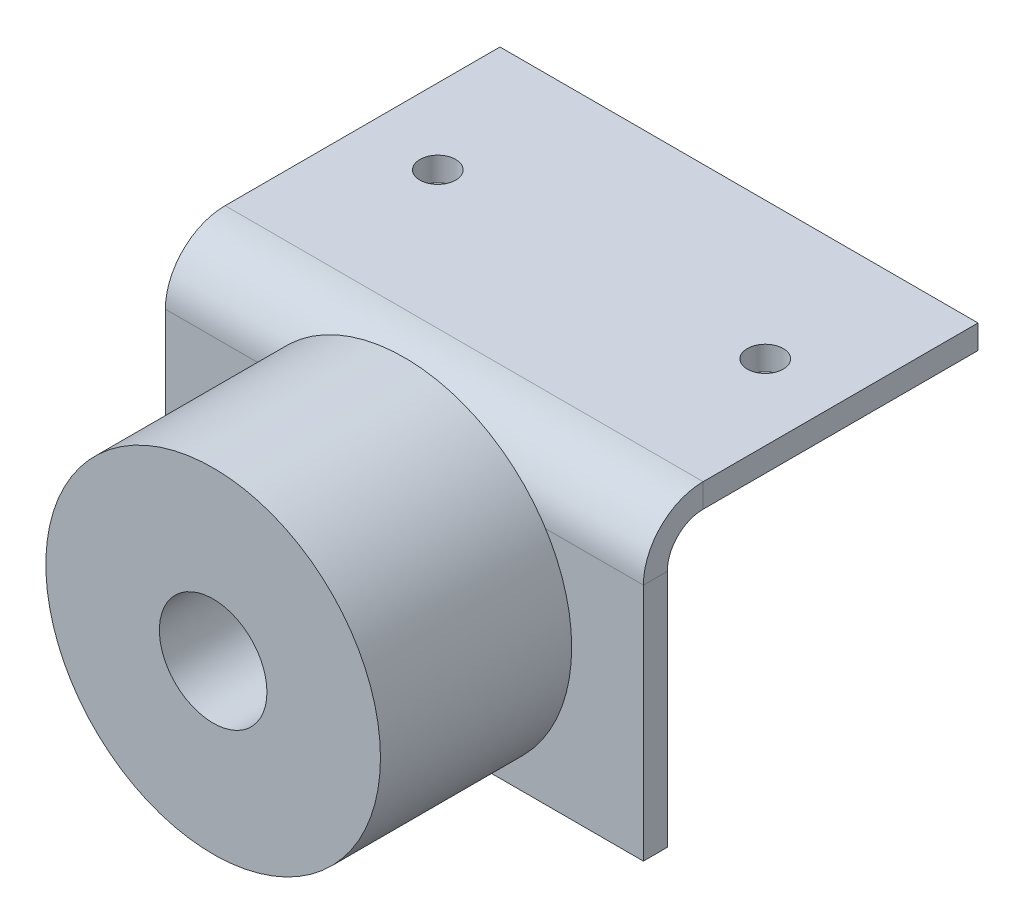
ISO-10303-21;
HEADER;
FILE_DESCRIPTION(('STEP AP214'),'2;1');
FILE_NAME('part.step','',(''),(''),'','','');
FILE_SCHEMA(('AUTOMOTIVE_DESIGN { 1 0 10303 214 1 1 1 1 }'));
ENDSEC;
DATA;
#1=APPLICATION_CONTEXT('core data for automotive mechanical design processes');
#2=APPLICATION_PROTOCOL_DEFINITION('international standard','automotive_design',2000,#1);
#3=PRODUCT_CONTEXT('',#1,'mechanical');
#4=PRODUCT('Part','Part','',(#3));
#5=PRODUCT_RELATED_PRODUCT_CATEGORY('part','',(#4));
#6=PRODUCT_DEFINITION_FORMATION('','',#4);
#7=PRODUCT_DEFINITION_CONTEXT('part definition',#1,'design');
#8=PRODUCT_DEFINITION('design','',#6,#7);
#9=PRODUCT_DEFINITION_SHAPE('','',#8);
#10=(LENGTH_UNIT() NAMED_UNIT(*) SI_UNIT(.MILLI.,.METRE.));
#11=(NAMED_UNIT(*) PLANE_ANGLE_UNIT() SI_UNIT($,.RADIAN.));
#12=(NAMED_UNIT(*) SI_UNIT($,.STERADIAN.) SOLID_ANGLE_UNIT());
#13=UNCERTAINTY_MEASURE_WITH_UNIT(LENGTH_MEASURE(1.E-05),#10,'distance_accuracy_value','');
#14=(GEOMETRIC_REPRESENTATION_CONTEXT(3) GLOBAL_UNCERTAINTY_ASSIGNED_CONTEXT((#13)) GLOBAL_UNIT_ASSIGNED_CONTEXT((#10,
#11,#12)) REPRESENTATION_CONTEXT('',''));
#15=CARTESIAN_POINT('',(0.,0.,0.));
#16=DIRECTION('',(0.,0.,1.));
#17=DIRECTION('',(1.,0.,0.));
#18=AXIS2_PLACEMENT_3D('',#15,#16,#17);
#19=CARTESIAN_POINT('',(20.,12.5,-5.));
#20=DIRECTION('',(1.,0.,0.));
#21=DIRECTION('',(0.,0.,-1.));
#22=AXIS2_PLACEMENT_3D('',#19,#20,#21);
#23=PLANE('',#22);
#24=DIRECTION('',(0.,-1.,0.));
#25=VECTOR('',#24,1.);
#26=CARTESIAN_POINT('',(20.,12.5,-5.));
#27=LINE('',#26,#25);
#28=CARTESIAN_POINT('',(20.,12.5,-5.));
#29=VERTEX_POINT('',#28);
#30=CARTESIAN_POINT('',(20.,10.5,-5.));
#31=VERTEX_POINT('',#30);
#32=EDGE_CURVE('E12',#29,#31,#27,.T.);
#33=ORIENTED_EDGE('',*,*,#32,.F.);
#34=CARTESIAN_POINT('',(20.,7.5,-5.));
#35=DIRECTION('',(1.,0.,0.));
#36=DIRECTION('',(0.,0.,-1.));
#37=AXIS2_PLACEMENT_3D('',#34,#35,#36);
#38=CIRCLE('',#37,5.);
#39=CARTESIAN_POINT('',(20.,7.5,0.));
#40=VERTEX_POINT('',#39);
#41=EDGE_CURVE('E147',#40,#29,#38,.F.);
#42=ORIENTED_EDGE('',*,*,#41,.F.);
#43=DIRECTION('',(0.,0.,1.));
#44=VECTOR('',#43,1.);
#45=CARTESIAN_POINT('',(20.,7.5,-2.));
#46=LINE('',#45,#44);
#47=CARTESIAN_POINT('',(20.,7.5,-2.));
#48=VERTEX_POINT('',#47);
#49=EDGE_CURVE('E58',#48,#40,#46,.T.);
#50=ORIENTED_EDGE('',*,*,#49,.F.);
#51=CARTESIAN_POINT('',(20.,7.5,-5.));
#52=DIRECTION('',(1.,0.,0.));
#53=DIRECTION('',(0.,0.,-1.));
#54=AXIS2_PLACEMENT_3D('',#51,#52,#53);
#55=CIRCLE('',#54,3.);
#56=EDGE_CURVE('E140',#48,#31,#55,.F.);
#57=ORIENTED_EDGE('',*,*,#56,.T.);
#58=EDGE_LOOP('',(#33,#42,#50,#57));
#59=FACE_BOUND('',#58,.T.);
#60=ADVANCED_FACE('F49',(#59),#23,.T.);
#61=CARTESIAN_POINT('',(20.,7.5,-2.));
#62=DIRECTION('',(1.,0.,0.));
#63=DIRECTION('',(0.,0.,-1.));
#64=AXIS2_PLACEMENT_3D('',#61,#62,#63);
#65=PLANE('',#64);
#66=DIRECTION('',(0.,0.,-1.));
#67=VECTOR('',#66,1.);
#68=CARTESIAN_POINT('',(20.,12.5,0.));
#69=LINE('',#68,#67);
#70=CARTESIAN_POINT('',(20.,12.5,-28.));
#71=VERTEX_POINT('',#70);
#72=EDGE_CURVE('E198',#29,#71,#69,.T.);
#73=ORIENTED_EDGE('',*,*,#72,.F.);
#74=ORIENTED_EDGE('',*,*,#32,.T.);
#75=DIRECTION('',(0.,0.,-1.));
#76=VECTOR('',#75,1.);
#77=CARTESIAN_POINT('',(20.,10.5,0.));
#78=LINE('',#77,#76);
#79=CARTESIAN_POINT('',(20.,10.5,-28.));
#80=VERTEX_POINT('',#79);
#81=EDGE_CURVE('E106',#31,#80,#78,.T.);
#82=ORIENTED_EDGE('',*,*,#81,.T.);
#83=DIRECTION('',(0.,-1.,0.));
#84=VECTOR('',#83,1.);
#85=CARTESIAN_POINT('',(20.,12.5,-28.));
#86=LINE('',#85,#84);
#87=EDGE_CURVE('E387',#71,#80,#86,.T.);
#88=ORIENTED_EDGE('',*,*,#87,.F.);
#89=EDGE_LOOP('',(#73,#74,#82,#88));
#90=FACE_BOUND('',#89,.T.);
#91=ADVANCED_FACE('F206',(#90),#65,.T.);
#92=CARTESIAN_POINT('',(-20.,7.5,0.));
#93=DIRECTION('',(-1.,0.,0.));
#94=DIRECTION('',(0.,0.,1.));
#95=AXIS2_PLACEMENT_3D('',#92,#93,#94);
#96=PLANE('',#95);
#97=DIRECTION('',(0.,0.,-1.));
#98=VECTOR('',#97,1.);
#99=CARTESIAN_POINT('',(-20.,7.5,0.));
#100=LINE('',#99,#98);
#101=CARTESIAN_POINT('',(-20.,7.5,0.));
#102=VERTEX_POINT('',#101);
#103=CARTESIAN_POINT('',(-20.,7.5,-2.));
#104=VERTEX_POINT('',#103);
#105=EDGE_CURVE('E93',#102,#104,#100,.T.);
#106=ORIENTED_EDGE('',*,*,#105,.F.);
#107=CARTESIAN_POINT('',(-20.,7.5,-5.));
#108=DIRECTION('',(1.,0.,0.));
#109=DIRECTION('',(0.,0.,-1.));
#110=AXIS2_PLACEMENT_3D('',#107,#108,#109);
#111=CIRCLE('',#110,5.);
#112=CARTESIAN_POINT('',(-20.,12.5,-5.));
#113=VERTEX_POINT('',#112);
#114=EDGE_CURVE('E163',#102,#113,#111,.F.);
#115=ORIENTED_EDGE('',*,*,#114,.T.);
#116=DIRECTION('',(0.,1.,0.));
#117=VECTOR('',#116,1.);
#118=CARTESIAN_POINT('',(-20.,10.5,-5.));
#119=LINE('',#118,#117);
#120=CARTESIAN_POINT('',(-20.,10.5,-5.));
#121=VERTEX_POINT('',#120);
#122=EDGE_CURVE('E100',#121,#113,#119,.T.);
#123=ORIENTED_EDGE('',*,*,#122,.F.);
#124=CARTESIAN_POINT('',(-20.,7.5,-5.));
#125=DIRECTION('',(1.,0.,0.));
#126=DIRECTION('',(0.,0.,-1.));
#127=AXIS2_PLACEMENT_3D('',#124,#125,#126);
#128=CIRCLE('',#127,3.);
#129=EDGE_CURVE('E170',#104,#121,#128,.F.);
#130=ORIENTED_EDGE('',*,*,#129,.F.);
#131=EDGE_LOOP('',(#106,#115,#123,#130));
#132=FACE_BOUND('',#131,.T.);
#133=ADVANCED_FACE('F204',(#132),#96,.T.);
#134=CARTESIAN_POINT('',(-20.,10.5,-5.));
#135=DIRECTION('',(-1.,0.,0.));
#136=DIRECTION('',(0.,0.,1.));
#137=AXIS2_PLACEMENT_3D('',#134,#135,#136);
#138=PLANE('',#137);
#139=DIRECTION('',(0.,1.,0.));
#140=VECTOR('',#139,1.);
#141=CARTESIAN_POINT('',(-20.,12.5,0.));
#142=LINE('',#141,#140);
#143=CARTESIAN_POINT('',(-20.,-12.5,0.));
#144=VERTEX_POINT('',#143);
#145=EDGE_CURVE('E165',#144,#102,#142,.T.);
#146=ORIENTED_EDGE('',*,*,#145,.T.);
#147=ORIENTED_EDGE('',*,*,#105,.T.);
#148=DIRECTION('',(0.,1.,0.));
#149=VECTOR('',#148,1.);
#150=CARTESIAN_POINT('',(-20.,12.5,-2.));
#151=LINE('',#150,#149);
#152=CARTESIAN_POINT('',(-20.,-12.5,-2.));
#153=VERTEX_POINT('',#152);
#154=EDGE_CURVE('E168',#153,#104,#151,.T.);
#155=ORIENTED_EDGE('',*,*,#154,.F.);
#156=DIRECTION('',(0.,0.,1.));
#157=VECTOR('',#156,1.);
#158=CARTESIAN_POINT('',(-20.,-12.5,-2.));
#159=LINE('',#158,#157);
#160=EDGE_CURVE('E128',#153,#144,#159,.T.);
#161=ORIENTED_EDGE('',*,*,#160,.T.);
#162=EDGE_LOOP('',(#146,#147,#155,#161));
#163=FACE_BOUND('',#162,.T.);
#164=ADVANCED_FACE('F200',(#163),#138,.T.);
#165=CARTESIAN_POINT('',(20.,10.5,0.));
#166=DIRECTION('',(0.,1.,0.));
#167=DIRECTION('',(0.,0.,1.));
#168=AXIS2_PLACEMENT_3D('',#165,#166,#167);
#169=PLANE('',#168);
#170=CARTESIAN_POINT('',(-13.7,10.5,-16.5));
#171=DIRECTION('',(0.,1.,0.));
#172=DIRECTION('',(0.,0.,1.));
#173=AXIS2_PLACEMENT_3D('',#170,#171,#172);
#174=CIRCLE('',#173,1.5);
#175=CARTESIAN_POINT('',(-13.7,10.5,-15.));
#176=VERTEX_POINT('',#175);
#177=EDGE_CURVE('E157',#176,#176,#174,.F.);
#178=ORIENTED_EDGE('',*,*,#177,.F.);
#179=EDGE_LOOP('',(#178));
#180=FACE_BOUND('',#179,.T.);
#181=CARTESIAN_POINT('',(13.7,10.5,-16.5));
#182=DIRECTION('',(0.,1.,0.));
#183=DIRECTION('',(0.,0.,1.));
#184=AXIS2_PLACEMENT_3D('',#181,#182,#183);
#185=CIRCLE('',#184,1.5);
#186=CARTESIAN_POINT('',(13.7,10.5,-15.));
#187=VERTEX_POINT('',#186);
#188=EDGE_CURVE('E376',#187,#187,#185,.F.);
#189=ORIENTED_EDGE('',*,*,#188,.F.);
#190=EDGE_LOOP('',(#189));
#191=FACE_BOUND('',#190,.T.);
#192=DIRECTION('',(0.,0.,-1.));
#193=VECTOR('',#192,1.);
#194=CARTESIAN_POINT('',(-20.,10.5,0.));
#195=LINE('',#194,#193);
#196=CARTESIAN_POINT('',(-20.,10.5,-28.));
#197=VERTEX_POINT('',#196);
#198=EDGE_CURVE('E153',#121,#197,#195,.T.);
#199=ORIENTED_EDGE('',*,*,#198,.T.);
#200=DIRECTION('',(-1.,0.,0.));
#201=VECTOR('',#200,1.);
#202=CARTESIAN_POINT('',(20.,10.5,-28.));
#203=LINE('',#202,#201);
#204=EDGE_CURVE('E184',#80,#197,#203,.T.);
#205=ORIENTED_EDGE('',*,*,#204,.F.);
#206=ORIENTED_EDGE('',*,*,#81,.F.);
#207=DIRECTION('',(-1.,0.,0.));
#208=VECTOR('',#207,1.);
#209=CARTESIAN_POINT('',(20.,10.5,-5.));
#210=LINE('',#209,#208);
#211=EDGE_CURVE('E152',#31,#121,#210,.T.);
#212=ORIENTED_EDGE('',*,*,#211,.T.);
#213=EDGE_LOOP('',(#199,#205,#206,#212));
#214=FACE_BOUND('',#213,.T.);
#215=ADVANCED_FACE('F212',(#180,#191,#214),#169,.F.);
#216=CARTESIAN_POINT('',(20.,12.5,-28.));
#217=DIRECTION('',(0.,0.,-1.));
#218=DIRECTION('',(-1.,0.,0.));
#219=AXIS2_PLACEMENT_3D('',#216,#217,#218);
#220=PLANE('',#219);
#221=DIRECTION('',(0.,-1.,0.));
#222=VECTOR('',#221,1.);
#223=CARTESIAN_POINT('',(-20.,12.5,-28.));
#224=LINE('',#223,#222);
#225=CARTESIAN_POINT('',(-20.,12.5,-28.));
#226=VERTEX_POINT('',#225);
#227=EDGE_CURVE('E156',#226,#197,#224,.T.);
#228=ORIENTED_EDGE('',*,*,#227,.F.);
#229=DIRECTION('',(-1.,0.,0.));
#230=VECTOR('',#229,1.);
#231=CARTESIAN_POINT('',(20.,12.5,-28.));
#232=LINE('',#231,#230);
#233=EDGE_CURVE('E182',#71,#226,#232,.T.);
#234=ORIENTED_EDGE('',*,*,#233,.F.);
#235=ORIENTED_EDGE('',*,*,#87,.T.);
#236=ORIENTED_EDGE('',*,*,#204,.T.);
#237=EDGE_LOOP('',(#228,#234,#235,#236));
#238=FACE_BOUND('',#237,.T.);
#239=ADVANCED_FACE('F241',(#238),#220,.T.);
#240=CARTESIAN_POINT('',(20.,12.5,0.));
#241=DIRECTION('',(0.,1.,0.));
#242=DIRECTION('',(0.,0.,1.));
#243=AXIS2_PLACEMENT_3D('',#240,#241,#242);
#244=PLANE('',#243);
#245=CARTESIAN_POINT('',(-13.7,12.5,-16.5));
#246=DIRECTION('',(0.,1.,0.));
#247=DIRECTION('',(0.,0.,1.));
#248=AXIS2_PLACEMENT_3D('',#245,#246,#247);
#249=CIRCLE('',#248,1.5);
#250=CARTESIAN_POINT('',(-13.7,12.5,-15.));
#251=VERTEX_POINT('',#250);
#252=EDGE_CURVE('E379',#251,#251,#249,.T.);
#253=ORIENTED_EDGE('',*,*,#252,.F.);
#254=EDGE_LOOP('',(#253));
#255=FACE_BOUND('',#254,.T.);
#256=CARTESIAN_POINT('',(13.7,12.5,-16.5));
#257=DIRECTION('',(0.,1.,0.));
#258=DIRECTION('',(0.,0.,1.));
#259=AXIS2_PLACEMENT_3D('',#256,#257,#258);
#260=CIRCLE('',#259,1.5);
#261=CARTESIAN_POINT('',(13.7,12.5,-15.));
#262=VERTEX_POINT('',#261);
#263=EDGE_CURVE('E373',#262,#262,#260,.T.);
#264=ORIENTED_EDGE('',*,*,#263,.F.);
#265=EDGE_LOOP('',(#264));
#266=FACE_BOUND('',#265,.T.);
#267=DIRECTION('',(0.,0.,-1.));
#268=VECTOR('',#267,1.);
#269=CARTESIAN_POINT('',(-20.,12.5,0.));
#270=LINE('',#269,#268);
#271=EDGE_CURVE('E160',#113,#226,#270,.T.);
#272=ORIENTED_EDGE('',*,*,#271,.F.);
#273=DIRECTION('',(-1.,0.,0.));
#274=VECTOR('',#273,1.);
#275=CARTESIAN_POINT('',(20.,12.5,-5.));
#276=LINE('',#275,#274);
#277=EDGE_CURVE('E179',#29,#113,#276,.T.);
#278=ORIENTED_EDGE('',*,*,#277,.F.);
#279=ORIENTED_EDGE('',*,*,#72,.T.);
#280=ORIENTED_EDGE('',*,*,#233,.T.);
#281=EDGE_LOOP('',(#272,#278,#279,#280));
#282=FACE_BOUND('',#281,.T.);
#283=ADVANCED_FACE('F246',(#255,#266,#282),#244,.T.);
#284=CARTESIAN_POINT('',(20.,7.5,-5.));
#285=DIRECTION('',(-1.,0.,0.));
#286=DIRECTION('',(0.,0.,1.));
#287=AXIS2_PLACEMENT_3D('',#284,#285,#286);
#288=CYLINDRICAL_SURFACE('',#287,5.);
#289=ORIENTED_EDGE('',*,*,#114,.F.);
#290=DIRECTION('',(-1.,0.,0.));
#291=VECTOR('',#290,1.);
#292=CARTESIAN_POINT('',(20.,7.5,0.));
#293=LINE('',#292,#291);
#294=EDGE_CURVE('E176',#40,#102,#293,.T.);
#295=ORIENTED_EDGE('',*,*,#294,.F.);
#296=ORIENTED_EDGE('',*,*,#41,.T.);
#297=ORIENTED_EDGE('',*,*,#277,.T.);
#298=EDGE_LOOP('',(#289,#295,#296,#297));
#299=FACE_BOUND('',#298,.T.);
#300=ADVANCED_FACE('F194',(#299),#288,.T.);
#301=CARTESIAN_POINT('',(20.,12.5,0.));
#302=DIRECTION('',(0.,0.,1.));
#303=DIRECTION('',(0.,-1.,0.));
#304=AXIS2_PLACEMENT_3D('',#301,#302,#303);
#305=PLANE('',#304);
#306=CARTESIAN_POINT('',(0.,0.,0.));
#307=DIRECTION('',(0.,0.,1.));
#308=DIRECTION('',(0.,-1.,0.));
#309=AXIS2_PLACEMENT_3D('',#306,#307,#308);
#310=CIRCLE('',#309,4.5);
#311=CARTESIAN_POINT('',(0.,-4.5,0.));
#312=VERTEX_POINT('',#311);
#313=EDGE_CURVE('E370',#312,#312,#310,.T.);
#314=ORIENTED_EDGE('',*,*,#313,.F.);
#315=EDGE_LOOP('',(#314));
#316=FACE_BOUND('',#315,.T.);
#317=ORIENTED_EDGE('',*,*,#145,.F.);
#318=DIRECTION('',(-1.,0.,0.));
#319=VECTOR('',#318,1.);
#320=CARTESIAN_POINT('',(20.,-12.5,0.));
#321=LINE('',#320,#319);
#322=CARTESIAN_POINT('',(20.,-12.5,0.));
#323=VERTEX_POINT('',#322);
#324=EDGE_CURVE('E130',#323,#144,#321,.T.);
#325=ORIENTED_EDGE('',*,*,#324,.F.);
#326=DIRECTION('',(0.,1.,0.));
#327=VECTOR('',#326,1.);
#328=CARTESIAN_POINT('',(20.,12.5,0.));
#329=LINE('',#328,#327);
#330=EDGE_CURVE('E145',#323,#40,#329,.T.);
#331=ORIENTED_EDGE('',*,*,#330,.T.);
#332=ORIENTED_EDGE('',*,*,#294,.T.);
#333=EDGE_LOOP('',(#317,#325,#331,#332));
#334=FACE_BOUND('',#333,.T.);
#335=ADVANCED_FACE('F199',(#316,#334),#305,.T.);
#336=CARTESIAN_POINT('',(20.,-12.5,-2.));
#337=DIRECTION('',(0.,-1.,0.));
#338=DIRECTION('',(0.,0.,-1.));
#339=AXIS2_PLACEMENT_3D('',#336,#337,#338);
#340=PLANE('',#339);
#341=ORIENTED_EDGE('',*,*,#160,.F.);
#342=DIRECTION('',(-1.,0.,0.));
#343=VECTOR('',#342,1.);
#344=CARTESIAN_POINT('',(20.,-12.5,-2.));
#345=LINE('',#344,#343);
#346=CARTESIAN_POINT('',(20.,-12.5,-2.));
#347=VERTEX_POINT('',#346);
#348=EDGE_CURVE('E122',#347,#153,#345,.T.);
#349=ORIENTED_EDGE('',*,*,#348,.F.);
#350=DIRECTION('',(0.,0.,1.));
#351=VECTOR('',#350,1.);
#352=CARTESIAN_POINT('',(20.,-12.5,-2.));
#353=LINE('',#352,#351);
#354=EDGE_CURVE('E126',#347,#323,#353,.T.);
#355=ORIENTED_EDGE('',*,*,#354,.T.);
#356=ORIENTED_EDGE('',*,*,#324,.T.);
#357=EDGE_LOOP('',(#341,#349,#355,#356));
#358=FACE_BOUND('',#357,.T.);
#359=ADVANCED_FACE('F124',(#358),#340,.T.);
#360=CARTESIAN_POINT('',(20.,12.5,-2.));
#361=DIRECTION('',(0.,0.,1.));
#362=DIRECTION('',(0.,-1.,0.));
#363=AXIS2_PLACEMENT_3D('',#360,#361,#362);
#364=PLANE('',#363);
#365=CARTESIAN_POINT('',(0.,0.,-2.));
#366=DIRECTION('',(0.,0.,1.));
#367=DIRECTION('',(0.,-1.,0.));
#368=AXIS2_PLACEMENT_3D('',#365,#366,#367);
#369=CIRCLE('',#368,4.5);
#370=CARTESIAN_POINT('',(0.,-4.5,-2.));
#371=VERTEX_POINT('',#370);
#372=EDGE_CURVE('E52',#371,#371,#369,.T.);
#373=ORIENTED_EDGE('',*,*,#372,.T.);
#374=EDGE_LOOP('',(#373));
#375=FACE_BOUND('',#374,.T.);
#376=ORIENTED_EDGE('',*,*,#154,.T.);
#377=DIRECTION('',(-1.,0.,0.));
#378=VECTOR('',#377,1.);
#379=CARTESIAN_POINT('',(20.,7.5,-2.));
#380=LINE('',#379,#378);
#381=EDGE_CURVE('E131',#48,#104,#380,.T.);
#382=ORIENTED_EDGE('',*,*,#381,.F.);
#383=DIRECTION('',(0.,1.,0.));
#384=VECTOR('',#383,1.);
#385=CARTESIAN_POINT('',(20.,12.5,-2.));
#386=LINE('',#385,#384);
#387=EDGE_CURVE('E135',#347,#48,#386,.T.);
#388=ORIENTED_EDGE('',*,*,#387,.F.);
#389=ORIENTED_EDGE('',*,*,#348,.T.);
#390=EDGE_LOOP('',(#376,#382,#388,#389));
#391=FACE_BOUND('',#390,.T.);
#392=ADVANCED_FACE('F136',(#375,#391),#364,.F.);
#393=CARTESIAN_POINT('',(20.,7.5,-5.));
#394=DIRECTION('',(-1.,0.,0.));
#395=DIRECTION('',(0.,0.,1.));
#396=AXIS2_PLACEMENT_3D('',#393,#394,#395);
#397=CYLINDRICAL_SURFACE('',#396,3.);
#398=ORIENTED_EDGE('',*,*,#129,.T.);
#399=ORIENTED_EDGE('',*,*,#211,.F.);
#400=ORIENTED_EDGE('',*,*,#56,.F.);
#401=ORIENTED_EDGE('',*,*,#381,.T.);
#402=EDGE_LOOP('',(#398,#399,#400,#401));
#403=FACE_BOUND('',#402,.T.);
#404=ADVANCED_FACE('F202',(#403),#397,.F.);
#405=CARTESIAN_POINT('',(20.,7.5,-5.));
#406=DIRECTION('',(1.,0.,0.));
#407=DIRECTION('',(0.,0.,-1.));
#408=AXIS2_PLACEMENT_3D('',#405,#406,#407);
#409=PLANE('',#408);
#410=ORIENTED_EDGE('',*,*,#387,.T.);
#411=ORIENTED_EDGE('',*,*,#49,.T.);
#412=ORIENTED_EDGE('',*,*,#330,.F.);
#413=ORIENTED_EDGE('',*,*,#354,.F.);
#414=EDGE_LOOP('',(#410,#411,#412,#413));
#415=FACE_BOUND('',#414,.T.);
#416=ADVANCED_FACE('F143',(#415),#409,.T.);
#417=CARTESIAN_POINT('',(-20.,7.5,-5.));
#418=DIRECTION('',(1.,0.,0.));
#419=DIRECTION('',(0.,0.,-1.));
#420=AXIS2_PLACEMENT_3D('',#417,#418,#419);
#421=PLANE('',#420);
#422=ORIENTED_EDGE('',*,*,#198,.F.);
#423=ORIENTED_EDGE('',*,*,#122,.T.);
#424=ORIENTED_EDGE('',*,*,#271,.T.);
#425=ORIENTED_EDGE('',*,*,#227,.T.);
#426=EDGE_LOOP('',(#422,#423,#424,#425));
#427=FACE_BOUND('',#426,.T.);
#428=ADVANCED_FACE('F290',(#427),#421,.F.);
#429=CARTESIAN_POINT('',(13.7,-14.001,-16.5));
#430=DIRECTION('',(0.,1.,0.));
#431=DIRECTION('',(0.,0.,1.));
#432=AXIS2_PLACEMENT_3D('',#429,#430,#431);
#433=CYLINDRICAL_SURFACE('',#432,1.5);
#434=ORIENTED_EDGE('',*,*,#263,.T.);
#435=EDGE_LOOP('',(#434));
#436=FACE_BOUND('',#435,.T.);
#437=ORIENTED_EDGE('',*,*,#188,.T.);
#438=EDGE_LOOP('',(#437));
#439=FACE_BOUND('',#438,.T.);
#440=ADVANCED_FACE('F300',(#436,#439),#433,.F.);
#441=CARTESIAN_POINT('',(-13.7,-14.001,-16.5));
#442=DIRECTION('',(0.,1.,0.));
#443=DIRECTION('',(0.,0.,1.));
#444=AXIS2_PLACEMENT_3D('',#441,#442,#443);
#445=CYLINDRICAL_SURFACE('',#444,1.5);
#446=ORIENTED_EDGE('',*,*,#252,.T.);
#447=EDGE_LOOP('',(#446));
#448=FACE_BOUND('',#447,.T.);
#449=ORIENTED_EDGE('',*,*,#177,.T.);
#450=EDGE_LOOP('',(#449));
#451=FACE_BOUND('',#450,.T.);
#452=ADVANCED_FACE('F327',(#448,#451),#445,.F.);
#453=CARTESIAN_POINT('',(0.,0.,-28.));
#454=DIRECTION('',(0.,0.,1.));
#455=DIRECTION('',(1.,0.,0.));
#456=AXIS2_PLACEMENT_3D('',#453,#454,#455);
#457=CYLINDRICAL_SURFACE('',#456,4.5);
#458=ORIENTED_EDGE('',*,*,#313,.T.);
#459=EDGE_LOOP('',(#458));
#460=FACE_BOUND('',#459,.T.);
#461=ORIENTED_EDGE('',*,*,#372,.F.);
#462=EDGE_LOOP('',(#461));
#463=FACE_BOUND('',#462,.T.);
#464=ADVANCED_FACE('F337',(#460,#463),#457,.F.);
#465=CLOSED_SHELL('',(#60,#91,#133,#164,#215,#239,#283,#300,#335,#359,#392,#404,#416,#428,#440,
#452,#464));
#466=MANIFOLD_SOLID_BREP('B2',#465);
#467=CARTESIAN_POINT('',(0.,0.,16.));
#468=DIRECTION('',(0.,0.,-1.));
#469=DIRECTION('',(-1.,0.,0.));
#470=AXIS2_PLACEMENT_3D('',#467,#468,#469);
#471=CYLINDRICAL_SURFACE('',#470,14.);
#472=CARTESIAN_POINT('',(0.,0.,16.));
#473=DIRECTION('',(0.,0.,1.));
#474=DIRECTION('',(1.,0.,0.));
#475=AXIS2_PLACEMENT_3D('',#472,#473,#474);
#476=CIRCLE('',#475,14.);
#477=CARTESIAN_POINT('',(14.,0.,16.));
#478=VERTEX_POINT('',#477);
#479=EDGE_CURVE('E48',#478,#478,#476,.T.);
#480=ORIENTED_EDGE('',*,*,#479,.F.);
#481=EDGE_LOOP('',(#480));
#482=FACE_BOUND('',#481,.T.);
#483=CARTESIAN_POINT('',(0.,0.,0.));
#484=DIRECTION('',(0.,0.,1.));
#485=DIRECTION('',(1.,0.,0.));
#486=AXIS2_PLACEMENT_3D('',#483,#484,#485);
#487=CIRCLE('',#486,14.);
#488=CARTESIAN_POINT('',(14.,0.,0.));
#489=VERTEX_POINT('',#488);
#490=EDGE_CURVE('E431',#489,#489,#487,.T.);
#491=ORIENTED_EDGE('',*,*,#490,.T.);
#492=EDGE_LOOP('',(#491));
#493=FACE_BOUND('',#492,.T.);
#494=ADVANCED_FACE('F424',(#482,#493),#471,.T.);
#495=CARTESIAN_POINT('',(0.,0.,16.));
#496=DIRECTION('',(0.,0.,1.));
#497=DIRECTION('',(1.,0.,0.));
#498=AXIS2_PLACEMENT_3D('',#495,#496,#497);
#499=PLANE('',#498);
#500=CARTESIAN_POINT('',(0.,0.,16.));
#501=DIRECTION('',(0.,0.,1.));
#502=DIRECTION('',(1.,0.,0.));
#503=AXIS2_PLACEMENT_3D('',#500,#501,#502);
#504=CIRCLE('',#503,4.5);
#505=CARTESIAN_POINT('',(4.5,0.,16.));
#506=VERTEX_POINT('',#505);
#507=EDGE_CURVE('E437',#506,#506,#504,.T.);
#508=ORIENTED_EDGE('',*,*,#507,.F.);
#509=EDGE_LOOP('',(#508));
#510=FACE_BOUND('',#509,.T.);
#511=ORIENTED_EDGE('',*,*,#479,.T.);
#512=EDGE_LOOP('',(#511));
#513=FACE_BOUND('',#512,.T.);
#514=ADVANCED_FACE('F453',(#510,#513),#499,.T.);
#515=CARTESIAN_POINT('',(0.,0.,0.));
#516=DIRECTION('',(0.,0.,1.));
#517=DIRECTION('',(1.,0.,0.));
#518=AXIS2_PLACEMENT_3D('',#515,#516,#517);
#519=PLANE('',#518);
#520=CARTESIAN_POINT('',(0.,0.,0.));
#521=DIRECTION('',(0.,0.,1.));
#522=DIRECTION('',(1.,0.,0.));
#523=AXIS2_PLACEMENT_3D('',#520,#521,#522);
#524=CIRCLE('',#523,4.5);
#525=CARTESIAN_POINT('',(4.5,0.,0.));
#526=VERTEX_POINT('',#525);
#527=EDGE_CURVE('E427',#526,#526,#524,.T.);
#528=ORIENTED_EDGE('',*,*,#527,.T.);
#529=EDGE_LOOP('',(#528));
#530=FACE_BOUND('',#529,.T.);
#531=ORIENTED_EDGE('',*,*,#490,.F.);
#532=EDGE_LOOP('',(#531));
#533=FACE_BOUND('',#532,.T.);
#534=ADVANCED_FACE('F444',(#530,#533),#519,.F.);
#535=CARTESIAN_POINT('',(0.,0.,-28.));
#536=DIRECTION('',(0.,0.,1.));
#537=DIRECTION('',(1.,0.,0.));
#538=AXIS2_PLACEMENT_3D('',#535,#536,#537);
#539=CYLINDRICAL_SURFACE('',#538,4.5);
#540=ORIENTED_EDGE('',*,*,#507,.T.);
#541=EDGE_LOOP('',(#540));
#542=FACE_BOUND('',#541,.T.);
#543=ORIENTED_EDGE('',*,*,#527,.F.);
#544=EDGE_LOOP('',(#543));
#545=FACE_BOUND('',#544,.T.);
#546=ADVANCED_FACE('F447',(#542,#545),#539,.F.);
#547=CLOSED_SHELL('',(#494,#514,#534,#546));
#548=MANIFOLD_SOLID_BREP('B6',#547);
#549=ADVANCED_BREP_SHAPE_REPRESENTATION('',(#18,#466,#548),#14);
#550=SHAPE_DEFINITION_REPRESENTATION(#9,#549);
ENDSEC;
END-ISO-10303-21;
